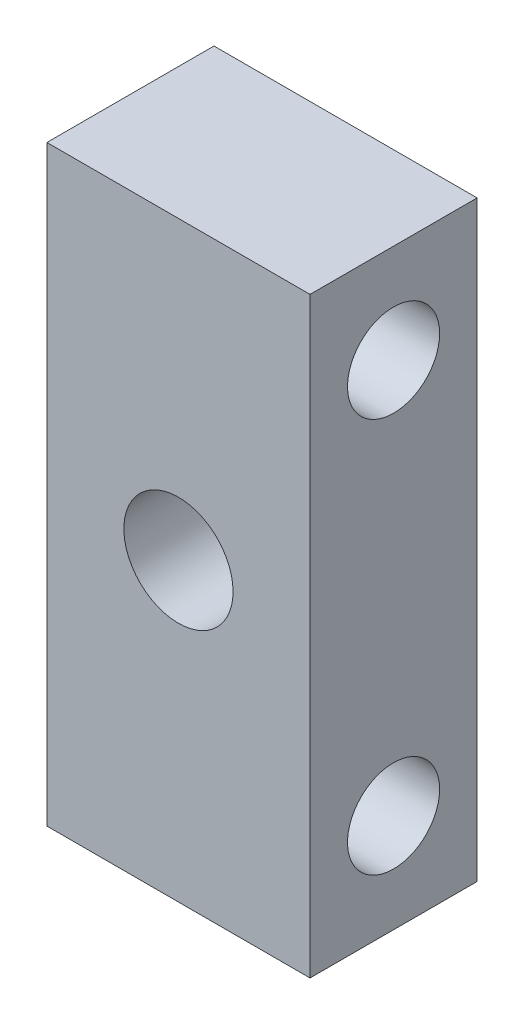
ISO-10303-21;
HEADER;
FILE_DESCRIPTION(('STEP AP214'),'2;1');
FILE_NAME('part.step','',(''),(''),'','','');
FILE_SCHEMA(('AUTOMOTIVE_DESIGN { 1 0 10303 214 1 1 1 1 }'));
ENDSEC;
DATA;
#1=APPLICATION_CONTEXT('core data for automotive mechanical design processes');
#2=APPLICATION_PROTOCOL_DEFINITION('international standard','automotive_design',2000,#1);
#3=PRODUCT_CONTEXT('',#1,'mechanical');
#4=PRODUCT('Part','Part','',(#3));
#5=PRODUCT_RELATED_PRODUCT_CATEGORY('part','',(#4));
#6=PRODUCT_DEFINITION_FORMATION('','',#4);
#7=PRODUCT_DEFINITION_CONTEXT('part definition',#1,'design');
#8=PRODUCT_DEFINITION('design','',#6,#7);
#9=PRODUCT_DEFINITION_SHAPE('','',#8);
#10=(LENGTH_UNIT() NAMED_UNIT(*) SI_UNIT(.MILLI.,.METRE.));
#11=(NAMED_UNIT(*) PLANE_ANGLE_UNIT() SI_UNIT($,.RADIAN.));
#12=(NAMED_UNIT(*) SI_UNIT($,.STERADIAN.) SOLID_ANGLE_UNIT());
#13=UNCERTAINTY_MEASURE_WITH_UNIT(LENGTH_MEASURE(1.E-05),#10,'distance_accuracy_value','');
#14=(GEOMETRIC_REPRESENTATION_CONTEXT(3) GLOBAL_UNCERTAINTY_ASSIGNED_CONTEXT((#13)) GLOBAL_UNIT_ASSIGNED_CONTEXT((#10,
#11,#12)) REPRESENTATION_CONTEXT('',''));
#15=CARTESIAN_POINT('',(0.,0.,0.));
#16=DIRECTION('',(0.,0.,1.));
#17=DIRECTION('',(1.,0.,0.));
#18=AXIS2_PLACEMENT_3D('',#15,#16,#17);
#19=CARTESIAN_POINT('',(-10.,22.5,12.7));
#20=DIRECTION('',(1.,0.,0.));
#21=DIRECTION('',(0.,0.,-1.));
#22=AXIS2_PLACEMENT_3D('',#19,#20,#21);
#23=PLANE('',#22);
#24=CARTESIAN_POINT('',(-10.,15.,6.35));
#25=DIRECTION('',(1.,0.,0.));
#26=DIRECTION('',(0.,0.,-1.));
#27=AXIS2_PLACEMENT_3D('',#24,#25,#26);
#28=CIRCLE('',#27,3.5);
#29=CARTESIAN_POINT('',(-10.,15.,2.85));
#30=VERTEX_POINT('',#29);
#31=EDGE_CURVE('E113',#30,#30,#28,.T.);
#32=ORIENTED_EDGE('',*,*,#31,.T.);
#33=EDGE_LOOP('',(#32));
#34=FACE_BOUND('',#33,.T.);
#35=CARTESIAN_POINT('',(-10.,-15.,6.35));
#36=DIRECTION('',(1.,0.,0.));
#37=DIRECTION('',(0.,0.,-1.));
#38=AXIS2_PLACEMENT_3D('',#35,#36,#37);
#39=CIRCLE('',#38,3.5);
#40=CARTESIAN_POINT('',(-10.,-15.,2.85));
#41=VERTEX_POINT('',#40);
#42=EDGE_CURVE('E119',#41,#41,#39,.T.);
#43=ORIENTED_EDGE('',*,*,#42,.T.);
#44=EDGE_LOOP('',(#43));
#45=FACE_BOUND('',#44,.T.);
#46=DIRECTION('',(0.,-1.,0.));
#47=VECTOR('',#46,1.);
#48=CARTESIAN_POINT('',(-10.,22.5,0.));
#49=LINE('',#48,#47);
#50=CARTESIAN_POINT('',(-10.,22.5,0.));
#51=VERTEX_POINT('',#50);
#52=CARTESIAN_POINT('',(-10.,-22.5,0.));
#53=VERTEX_POINT('',#52);
#54=EDGE_CURVE('E96',#51,#53,#49,.T.);
#55=ORIENTED_EDGE('',*,*,#54,.T.);
#56=DIRECTION('',(0.,0.,-1.));
#57=VECTOR('',#56,1.);
#58=CARTESIAN_POINT('',(-10.,-22.5,12.7));
#59=LINE('',#58,#57);
#60=CARTESIAN_POINT('',(-10.,-22.5,12.7));
#61=VERTEX_POINT('',#60);
#62=EDGE_CURVE('E11',#61,#53,#59,.T.);
#63=ORIENTED_EDGE('',*,*,#62,.F.);
#64=DIRECTION('',(0.,-1.,0.));
#65=VECTOR('',#64,1.);
#66=CARTESIAN_POINT('',(-10.,22.5,12.7));
#67=LINE('',#66,#65);
#68=CARTESIAN_POINT('',(-10.,22.5,12.7));
#69=VERTEX_POINT('',#68);
#70=EDGE_CURVE('E84',#69,#61,#67,.T.);
#71=ORIENTED_EDGE('',*,*,#70,.F.);
#72=DIRECTION('',(0.,0.,-1.));
#73=VECTOR('',#72,1.);
#74=CARTESIAN_POINT('',(-10.,22.5,12.7));
#75=LINE('',#74,#73);
#76=EDGE_CURVE('E92',#69,#51,#75,.T.);
#77=ORIENTED_EDGE('',*,*,#76,.T.);
#78=EDGE_LOOP('',(#55,#63,#71,#77));
#79=FACE_BOUND('',#78,.T.);
#80=ADVANCED_FACE('F33',(#34,#45,#79),#23,.F.);
#81=CARTESIAN_POINT('',(10.,-22.5,12.7));
#82=DIRECTION('',(0.,1.,0.));
#83=DIRECTION('',(-1.,0.,0.));
#84=AXIS2_PLACEMENT_3D('',#81,#82,#83);
#85=PLANE('',#84);
#86=DIRECTION('',(1.,0.,0.));
#87=VECTOR('',#86,1.);
#88=CARTESIAN_POINT('',(10.,-22.5,0.));
#89=LINE('',#88,#87);
#90=CARTESIAN_POINT('',(10.,-22.5,0.));
#91=VERTEX_POINT('',#90);
#92=EDGE_CURVE('E88',#53,#91,#89,.T.);
#93=ORIENTED_EDGE('',*,*,#92,.T.);
#94=DIRECTION('',(0.,0.,-1.));
#95=VECTOR('',#94,1.);
#96=CARTESIAN_POINT('',(10.,-22.5,12.7));
#97=LINE('',#96,#95);
#98=CARTESIAN_POINT('',(10.,-22.5,12.7));
#99=VERTEX_POINT('',#98);
#100=EDGE_CURVE('E41',#99,#91,#97,.T.);
#101=ORIENTED_EDGE('',*,*,#100,.F.);
#102=DIRECTION('',(1.,0.,0.));
#103=VECTOR('',#102,1.);
#104=CARTESIAN_POINT('',(10.,-22.5,12.7));
#105=LINE('',#104,#103);
#106=EDGE_CURVE('E79',#61,#99,#105,.T.);
#107=ORIENTED_EDGE('',*,*,#106,.F.);
#108=ORIENTED_EDGE('',*,*,#62,.T.);
#109=EDGE_LOOP('',(#93,#101,#107,#108));
#110=FACE_BOUND('',#109,.T.);
#111=ADVANCED_FACE('F87',(#110),#85,.F.);
#112=CARTESIAN_POINT('',(10.,22.5,12.7));
#113=DIRECTION('',(-1.,0.,0.));
#114=DIRECTION('',(0.,0.,1.));
#115=AXIS2_PLACEMENT_3D('',#112,#113,#114);
#116=PLANE('',#115);
#117=CARTESIAN_POINT('',(10.,15.,6.35));
#118=DIRECTION('',(1.,0.,0.));
#119=DIRECTION('',(0.,0.,-1.));
#120=AXIS2_PLACEMENT_3D('',#117,#118,#119);
#121=CIRCLE('',#120,3.5);
#122=CARTESIAN_POINT('',(10.,15.,2.85));
#123=VERTEX_POINT('',#122);
#124=EDGE_CURVE('E122',#123,#123,#121,.T.);
#125=ORIENTED_EDGE('',*,*,#124,.F.);
#126=EDGE_LOOP('',(#125));
#127=FACE_BOUND('',#126,.T.);
#128=CARTESIAN_POINT('',(10.,-15.,6.35));
#129=DIRECTION('',(1.,0.,0.));
#130=DIRECTION('',(0.,0.,-1.));
#131=AXIS2_PLACEMENT_3D('',#128,#129,#130);
#132=CIRCLE('',#131,3.5);
#133=CARTESIAN_POINT('',(10.,-15.,2.85));
#134=VERTEX_POINT('',#133);
#135=EDGE_CURVE('E116',#134,#134,#132,.T.);
#136=ORIENTED_EDGE('',*,*,#135,.F.);
#137=EDGE_LOOP('',(#136));
#138=FACE_BOUND('',#137,.T.);
#139=DIRECTION('',(0.,1.,0.));
#140=VECTOR('',#139,1.);
#141=CARTESIAN_POINT('',(10.,22.5,0.));
#142=LINE('',#141,#140);
#143=CARTESIAN_POINT('',(10.,22.5,0.));
#144=VERTEX_POINT('',#143);
#145=EDGE_CURVE('E66',#91,#144,#142,.T.);
#146=ORIENTED_EDGE('',*,*,#145,.T.);
#147=DIRECTION('',(0.,0.,-1.));
#148=VECTOR('',#147,1.);
#149=CARTESIAN_POINT('',(10.,22.5,12.7));
#150=LINE('',#149,#148);
#151=CARTESIAN_POINT('',(10.,22.5,12.7));
#152=VERTEX_POINT('',#151);
#153=EDGE_CURVE('E89',#152,#144,#150,.T.);
#154=ORIENTED_EDGE('',*,*,#153,.F.);
#155=DIRECTION('',(0.,1.,0.));
#156=VECTOR('',#155,1.);
#157=CARTESIAN_POINT('',(10.,22.5,12.7));
#158=LINE('',#157,#156);
#159=EDGE_CURVE('E82',#99,#152,#158,.T.);
#160=ORIENTED_EDGE('',*,*,#159,.F.);
#161=ORIENTED_EDGE('',*,*,#100,.T.);
#162=EDGE_LOOP('',(#146,#154,#160,#161));
#163=FACE_BOUND('',#162,.T.);
#164=ADVANCED_FACE('F90',(#127,#138,#163),#116,.F.);
#165=CARTESIAN_POINT('',(10.,22.5,12.7));
#166=DIRECTION('',(0.,-1.,0.));
#167=DIRECTION('',(0.,0.,-1.));
#168=AXIS2_PLACEMENT_3D('',#165,#166,#167);
#169=PLANE('',#168);
#170=DIRECTION('',(-1.,0.,0.));
#171=VECTOR('',#170,1.);
#172=CARTESIAN_POINT('',(10.,22.5,0.));
#173=LINE('',#172,#171);
#174=EDGE_CURVE('E72',#144,#51,#173,.T.);
#175=ORIENTED_EDGE('',*,*,#174,.T.);
#176=ORIENTED_EDGE('',*,*,#76,.F.);
#177=DIRECTION('',(-1.,0.,0.));
#178=VECTOR('',#177,1.);
#179=CARTESIAN_POINT('',(10.,22.5,12.7));
#180=LINE('',#179,#178);
#181=EDGE_CURVE('E49',#152,#69,#180,.T.);
#182=ORIENTED_EDGE('',*,*,#181,.F.);
#183=ORIENTED_EDGE('',*,*,#153,.T.);
#184=EDGE_LOOP('',(#175,#176,#182,#183));
#185=FACE_BOUND('',#184,.T.);
#186=ADVANCED_FACE('F104',(#185),#169,.F.);
#187=CARTESIAN_POINT('',(0.,0.,12.7));
#188=DIRECTION('',(0.,0.,-1.));
#189=DIRECTION('',(-1.,0.,0.));
#190=AXIS2_PLACEMENT_3D('',#187,#188,#189);
#191=PLANE('',#190);
#192=CARTESIAN_POINT('',(0.,0.,12.7));
#193=DIRECTION('',(0.,0.,1.));
#194=DIRECTION('',(1.,0.,0.));
#195=AXIS2_PLACEMENT_3D('',#192,#193,#194);
#196=CIRCLE('',#195,4.15);
#197=CARTESIAN_POINT('',(4.15,0.,12.7));
#198=VERTEX_POINT('',#197);
#199=EDGE_CURVE('E110',#198,#198,#196,.T.);
#200=ORIENTED_EDGE('',*,*,#199,.F.);
#201=EDGE_LOOP('',(#200));
#202=FACE_BOUND('',#201,.T.);
#203=ORIENTED_EDGE('',*,*,#70,.T.);
#204=ORIENTED_EDGE('',*,*,#106,.T.);
#205=ORIENTED_EDGE('',*,*,#159,.T.);
#206=ORIENTED_EDGE('',*,*,#181,.T.);
#207=EDGE_LOOP('',(#203,#204,#205,#206));
#208=FACE_BOUND('',#207,.T.);
#209=ADVANCED_FACE('F80',(#202,#208),#191,.F.);
#210=CARTESIAN_POINT('',(0.,0.,0.));
#211=DIRECTION('',(0.,0.,-1.));
#212=DIRECTION('',(-1.,0.,0.));
#213=AXIS2_PLACEMENT_3D('',#210,#211,#212);
#214=PLANE('',#213);
#215=CARTESIAN_POINT('',(0.,0.,0.));
#216=DIRECTION('',(0.,0.,1.));
#217=DIRECTION('',(1.,0.,0.));
#218=AXIS2_PLACEMENT_3D('',#215,#216,#217);
#219=CIRCLE('',#218,4.15);
#220=CARTESIAN_POINT('',(4.15,0.,0.));
#221=VERTEX_POINT('',#220);
#222=EDGE_CURVE('E99',#221,#221,#219,.T.);
#223=ORIENTED_EDGE('',*,*,#222,.T.);
#224=EDGE_LOOP('',(#223));
#225=FACE_BOUND('',#224,.T.);
#226=ORIENTED_EDGE('',*,*,#54,.F.);
#227=ORIENTED_EDGE('',*,*,#174,.F.);
#228=ORIENTED_EDGE('',*,*,#145,.F.);
#229=ORIENTED_EDGE('',*,*,#92,.F.);
#230=EDGE_LOOP('',(#226,#227,#228,#229));
#231=FACE_BOUND('',#230,.T.);
#232=ADVANCED_FACE('F107',(#225,#231),#214,.T.);
#233=CARTESIAN_POINT('',(0.,0.,0.));
#234=DIRECTION('',(0.,0.,1.));
#235=DIRECTION('',(1.,0.,0.));
#236=AXIS2_PLACEMENT_3D('',#233,#234,#235);
#237=CYLINDRICAL_SURFACE('',#236,4.15);
#238=ORIENTED_EDGE('',*,*,#222,.F.);
#239=EDGE_LOOP('',(#238));
#240=FACE_BOUND('',#239,.T.);
#241=ORIENTED_EDGE('',*,*,#199,.T.);
#242=EDGE_LOOP('',(#241));
#243=FACE_BOUND('',#242,.T.);
#244=ADVANCED_FACE('F143',(#240,#243),#237,.F.);
#245=CARTESIAN_POINT('',(-10.,-15.,6.35));
#246=DIRECTION('',(1.,0.,0.));
#247=DIRECTION('',(0.,0.,-1.));
#248=AXIS2_PLACEMENT_3D('',#245,#246,#247);
#249=CYLINDRICAL_SURFACE('',#248,3.5);
#250=ORIENTED_EDGE('',*,*,#42,.F.);
#251=EDGE_LOOP('',(#250));
#252=FACE_BOUND('',#251,.T.);
#253=ORIENTED_EDGE('',*,*,#135,.T.);
#254=EDGE_LOOP('',(#253));
#255=FACE_BOUND('',#254,.T.);
#256=ADVANCED_FACE('F133',(#252,#255),#249,.F.);
#257=CARTESIAN_POINT('',(-10.,15.,6.35));
#258=DIRECTION('',(1.,0.,0.));
#259=DIRECTION('',(0.,0.,-1.));
#260=AXIS2_PLACEMENT_3D('',#257,#258,#259);
#261=CYLINDRICAL_SURFACE('',#260,3.5);
#262=ORIENTED_EDGE('',*,*,#31,.F.);
#263=EDGE_LOOP('',(#262));
#264=FACE_BOUND('',#263,.T.);
#265=ORIENTED_EDGE('',*,*,#124,.T.);
#266=EDGE_LOOP('',(#265));
#267=FACE_BOUND('',#266,.T.);
#268=ADVANCED_FACE('F130',(#264,#267),#261,.F.);
#269=CLOSED_SHELL('',(#80,#111,#164,#186,#209,#232,#244,#256,#268));
#270=MANIFOLD_SOLID_BREP('B2',#269);
#271=ADVANCED_BREP_SHAPE_REPRESENTATION('',(#18,#270),#14);
#272=SHAPE_DEFINITION_REPRESENTATION(#9,#271);
ENDSEC;
END-ISO-10303-21;
